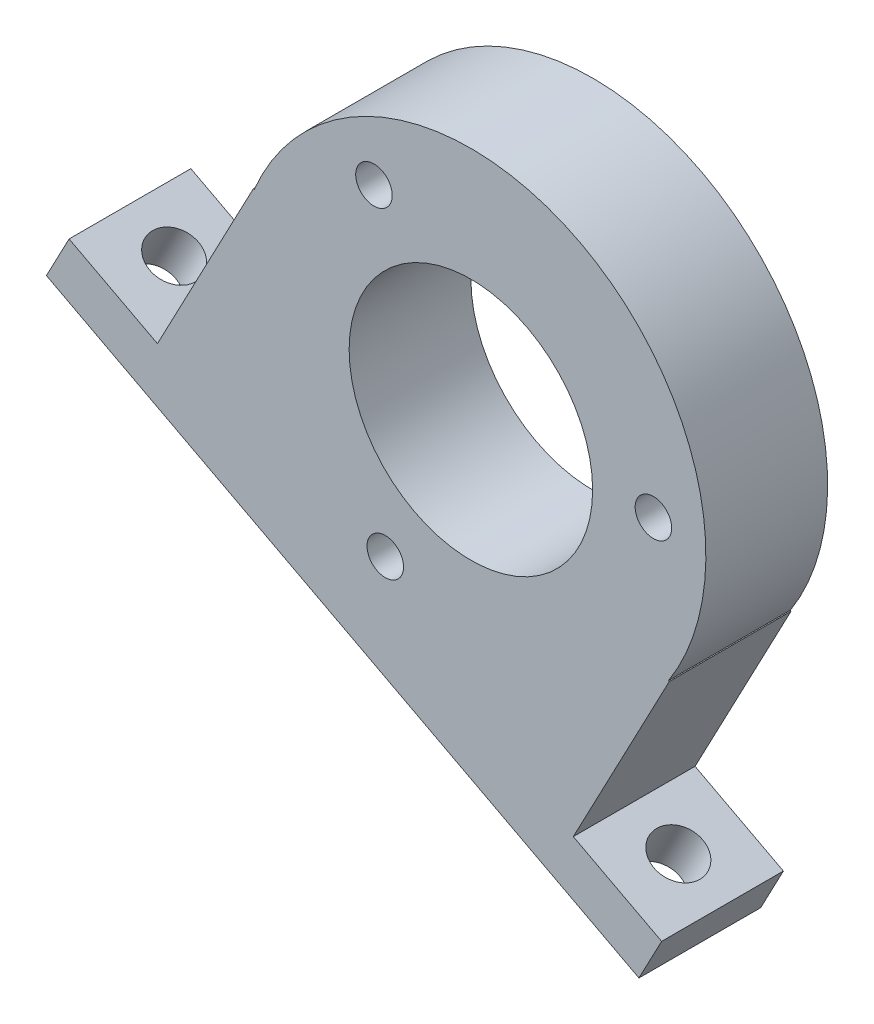
ISO-10303-21;
HEADER;
FILE_DESCRIPTION(('STEP AP214'),'2;1');
FILE_NAME('part.step','',(''),(''),'','','');
FILE_SCHEMA(('AUTOMOTIVE_DESIGN { 1 0 10303 214 1 1 1 1 }'));
ENDSEC;
DATA;
#1=APPLICATION_CONTEXT('core data for automotive mechanical design processes');
#2=APPLICATION_PROTOCOL_DEFINITION('international standard','automotive_design',2000,#1);
#3=PRODUCT_CONTEXT('',#1,'mechanical');
#4=PRODUCT('Part','Part','',(#3));
#5=PRODUCT_RELATED_PRODUCT_CATEGORY('part','',(#4));
#6=PRODUCT_DEFINITION_FORMATION('','',#4);
#7=PRODUCT_DEFINITION_CONTEXT('part definition',#1,'design');
#8=PRODUCT_DEFINITION('design','',#6,#7);
#9=PRODUCT_DEFINITION_SHAPE('','',#8);
#10=(LENGTH_UNIT() NAMED_UNIT(*) SI_UNIT(.MILLI.,.METRE.));
#11=(NAMED_UNIT(*) PLANE_ANGLE_UNIT() SI_UNIT($,.RADIAN.));
#12=(NAMED_UNIT(*) SI_UNIT($,.STERADIAN.) SOLID_ANGLE_UNIT());
#13=UNCERTAINTY_MEASURE_WITH_UNIT(LENGTH_MEASURE(1.E-05),#10,'distance_accuracy_value','');
#14=(GEOMETRIC_REPRESENTATION_CONTEXT(3) GLOBAL_UNCERTAINTY_ASSIGNED_CONTEXT((#13)) GLOBAL_UNIT_ASSIGNED_CONTEXT((#10,
#11,#12)) REPRESENTATION_CONTEXT('',''));
#15=CARTESIAN_POINT('',(0.,0.,0.));
#16=DIRECTION('',(0.,0.,1.));
#17=DIRECTION('',(1.,0.,0.));
#18=AXIS2_PLACEMENT_3D('',#15,#16,#17);
#19=CARTESIAN_POINT('',(20.1762336666455,11.5004949144842,0.));
#20=DIRECTION('',(-0.884809362447748,0.465953208085115,0.));
#21=DIRECTION('',(-0.465953208085115,-0.884809362447748,0.));
#22=AXIS2_PLACEMENT_3D('',#19,#20,#21);
#23=PLANE('',#22);
#24=DIRECTION('',(-0.465953208085115,-0.884809362447748,0.));
#25=VECTOR('',#24,1.);
#26=CARTESIAN_POINT('',(20.1762336666455,11.5004949144842,10.));
#27=LINE('',#26,#25);
#28=CARTESIAN_POINT('',(1.53810534324094,-23.8918795834258,10.));
#29=VERTEX_POINT('',#28);
#30=CARTESIAN_POINT('',(-0.325707489099525,-27.4311170332167,10.));
#31=VERTEX_POINT('',#30);
#32=EDGE_CURVE('E172',#29,#31,#27,.T.);
#33=ORIENTED_EDGE('',*,*,#32,.T.);
#34=DIRECTION('',(0.,0.,-1.));
#35=VECTOR('',#34,1.);
#36=CARTESIAN_POINT('',(-0.325707489099525,-27.4311170332167,50.));
#37=LINE('',#36,#35);
#38=CARTESIAN_POINT('',(-0.325707489099525,-27.4311170332167,0.));
#39=VERTEX_POINT('',#38);
#40=EDGE_CURVE('E161',#31,#39,#37,.T.);
#41=ORIENTED_EDGE('',*,*,#40,.T.);
#42=DIRECTION('',(-0.465953208085115,-0.884809362447748,0.));
#43=VECTOR('',#42,1.);
#44=CARTESIAN_POINT('',(20.1762336666455,11.5004949144842,0.));
#45=LINE('',#44,#43);
#46=CARTESIAN_POINT('',(1.53810534324094,-23.8918795834258,0.));
#47=VERTEX_POINT('',#46);
#48=EDGE_CURVE('E12',#47,#39,#45,.T.);
#49=ORIENTED_EDGE('',*,*,#48,.F.);
#50=DIRECTION('',(0.,0.,-1.));
#51=VECTOR('',#50,1.);
#52=CARTESIAN_POINT('',(1.53810534324094,-23.8918795834258,50.));
#53=LINE('',#52,#51);
#54=EDGE_CURVE('E199',#29,#47,#53,.T.);
#55=ORIENTED_EDGE('',*,*,#54,.F.);
#56=EDGE_LOOP('',(#33,#41,#49,#55));
#57=FACE_BOUND('',#56,.T.);
#58=ADVANCED_FACE('F81',(#57),#23,.F.);
#59=CARTESIAN_POINT('',(-28.4882812679806,37.1279213591655,0.));
#60=DIRECTION('',(-0.884809362447748,0.465953208085115,0.));
#61=DIRECTION('',(-0.465953208085115,-0.884809362447748,0.));
#62=AXIS2_PLACEMENT_3D('',#59,#60,#61);
#63=PLANE('',#62);
#64=DIRECTION('',(0.,0.,-1.));
#65=VECTOR('',#64,1.);
#66=CARTESIAN_POINT('',(-48.9902224237257,-1.80369058853542,50.));
#67=LINE('',#66,#65);
#68=CARTESIAN_POINT('',(-48.9902224237257,-1.80369058853542,10.));
#69=VERTEX_POINT('',#68);
#70=CARTESIAN_POINT('',(-48.9902224237257,-1.8036905885354,0.));
#71=VERTEX_POINT('',#70);
#72=EDGE_CURVE('E106',#69,#71,#67,.T.);
#73=ORIENTED_EDGE('',*,*,#72,.F.);
#74=DIRECTION('',(-0.465953208085115,-0.884809362447748,0.));
#75=VECTOR('',#74,1.);
#76=CARTESIAN_POINT('',(-28.4882812679806,37.1279213591655,9.99999999999999));
#77=LINE('',#76,#75);
#78=CARTESIAN_POINT('',(-47.1264095913852,1.73554686125559,10.));
#79=VERTEX_POINT('',#78);
#80=EDGE_CURVE('E231',#79,#69,#77,.T.);
#81=ORIENTED_EDGE('',*,*,#80,.F.);
#82=DIRECTION('',(0.,0.,-1.));
#83=VECTOR('',#82,1.);
#84=CARTESIAN_POINT('',(-47.1264095913852,1.73554686125559,50.));
#85=LINE('',#84,#83);
#86=CARTESIAN_POINT('',(-47.1264095913852,1.73554686125559,0.));
#87=VERTEX_POINT('',#86);
#88=EDGE_CURVE('E201',#79,#87,#85,.T.);
#89=ORIENTED_EDGE('',*,*,#88,.T.);
#90=DIRECTION('',(-0.465953208085115,-0.884809362447748,0.));
#91=VECTOR('',#90,1.);
#92=CARTESIAN_POINT('',(-28.4882812679806,37.1279213591655,0.));
#93=LINE('',#92,#91);
#94=EDGE_CURVE('E90',#87,#71,#93,.T.);
#95=ORIENTED_EDGE('',*,*,#94,.T.);
#96=EDGE_LOOP('',(#73,#81,#89,#95));
#97=FACE_BOUND('',#96,.T.);
#98=ADVANCED_FACE('F279',(#97),#63,.T.);
#99=CARTESIAN_POINT('',(-14.1274224536891,5.37928778044315,10.));
#100=DIRECTION('',(0.,0.,1.));
#101=DIRECTION('',(1.,0.,0.));
#102=AXIS2_PLACEMENT_3D('',#99,#100,#101);
#103=PLANE('',#102);
#104=CARTESIAN_POINT('',(0.862954928663437,5.916489730044,10.));
#105=DIRECTION('',(0.,0.,1.));
#106=DIRECTION('',(1.,0.,0.));
#107=AXIS2_PLACEMENT_3D('',#104,#105,#106);
#108=CIRCLE('',#107,1.5);
#109=CARTESIAN_POINT('',(2.36295492866344,5.916489730044,10.));
#110=VERTEX_POINT('',#109);
#111=EDGE_CURVE('E246',#110,#110,#108,.F.);
#112=ORIENTED_EDGE('',*,*,#111,.T.);
#113=EDGE_LOOP('',(#112));
#114=FACE_BOUND('',#113,.T.);
#115=CARTESIAN_POINT('',(-22.0878416801824,18.0927344310751,10.));
#116=DIRECTION('',(0.,0.,1.));
#117=DIRECTION('',(1.,0.,0.));
#118=AXIS2_PLACEMENT_3D('',#115,#116,#117);
#119=CIRCLE('',#118,1.5);
#120=CARTESIAN_POINT('',(-20.5878416801824,18.0927344310751,10.));
#121=VERTEX_POINT('',#120);
#122=EDGE_CURVE('E311',#121,#121,#119,.F.);
#123=ORIENTED_EDGE('',*,*,#122,.T.);
#124=EDGE_LOOP('',(#123));
#125=FACE_BOUND('',#124,.T.);
#126=CARTESIAN_POINT('',(-21.1573806095481,-7.87136081979077,10.));
#127=DIRECTION('',(0.,0.,1.));
#128=DIRECTION('',(1.,0.,0.));
#129=AXIS2_PLACEMENT_3D('',#126,#127,#128);
#130=CIRCLE('',#129,1.5);
#131=CARTESIAN_POINT('',(-19.6573806095481,-7.87136081979077,10.));
#132=VERTEX_POINT('',#131);
#133=EDGE_CURVE('E315',#132,#132,#130,.F.);
#134=ORIENTED_EDGE('',*,*,#133,.T.);
#135=EDGE_LOOP('',(#134));
#136=FACE_BOUND('',#135,.T.);
#137=CARTESIAN_POINT('',(-14.1274224536892,5.37928778044321,10.));
#138=DIRECTION('',(0.,0.,1.));
#139=DIRECTION('',(1.,0.,0.));
#140=AXIS2_PLACEMENT_3D('',#137,#138,#139);
#141=CIRCLE('',#140,10.);
#142=CARTESIAN_POINT('',(-4.12742245368918,5.37928778044321,10.));
#143=VERTEX_POINT('',#142);
#144=EDGE_CURVE('E318',#143,#143,#141,.F.);
#145=ORIENTED_EDGE('',*,*,#144,.T.);
#146=EDGE_LOOP('',(#145));
#147=FACE_BOUND('',#146,.T.);
#148=DIRECTION('',(-0.884809362447748,0.465953208085115,0.));
#149=VECTOR('',#148,1.);
#150=CARTESIAN_POINT('',(-24.6579649564127,-14.617403810876,10.));
#151=LINE('',#150,#149);
#152=EDGE_CURVE('E228',#31,#69,#151,.T.);
#153=ORIENTED_EDGE('',*,*,#152,.F.);
#154=ORIENTED_EDGE('',*,*,#32,.F.);
#155=DIRECTION('',(-0.884809362447748,0.465953208085115,0.));
#156=VECTOR('',#155,1.);
#157=CARTESIAN_POINT('',(-22.7941521240722,-11.078166361085,10.));
#158=LINE('',#157,#156);
#159=CARTESIAN_POINT('',(-5.7173314288307,-20.0710632771278,10.));
#160=VERTEX_POINT('',#159);
#161=EDGE_CURVE('E217',#29,#160,#158,.T.);
#162=ORIENTED_EDGE('',*,*,#161,.T.);
#163=DIRECTION('',(0.465953208085115,0.884809362447748,0.));
#164=VECTOR('',#163,1.);
#165=CARTESIAN_POINT('',(2.94939824155248,-3.61360913559957,10.));
#166=LINE('',#165,#164);
#167=CARTESIAN_POINT('',(2.17037819423765,-5.092908385907,10.));
#168=VERTEX_POINT('',#167);
#169=EDGE_CURVE('E220',#160,#168,#166,.T.);
#170=ORIENTED_EDGE('',*,*,#169,.T.);
#171=DIRECTION('',(0.884809362447748,-0.465953208085115,0.));
#172=VECTOR('',#171,1.);
#173=CARTESIAN_POINT('',(-14.9064425010039,3.89998853013572,10.));
#174=LINE('',#173,#172);
#175=CARTESIAN_POINT('',(2.10618453850619,-5.05910309281648,10.));
#176=VERTEX_POINT('',#175);
#177=EDGE_CURVE('E223',#176,#168,#174,.T.);
#178=ORIENTED_EDGE('',*,*,#177,.F.);
#179=CARTESIAN_POINT('',(-14.1274224536891,5.37928778044315,10.));
#180=DIRECTION('',(0.,0.,1.));
#181=DIRECTION('',(1.,0.,0.));
#182=AXIS2_PLACEMENT_3D('',#179,#180,#181);
#183=CIRCLE('',#182,19.3);
#184=CARTESIAN_POINT('',(-31.919069540514,12.8590801530879,10.));
#185=VERTEX_POINT('',#184);
#186=EDGE_CURVE('E225',#176,#185,#183,.T.);
#187=ORIENTED_EDGE('',*,*,#186,.T.);
#188=DIRECTION('',(0.884809362447748,-0.465953208085115,0.));
#189=VECTOR('',#188,1.);
#190=CARTESIAN_POINT('',(-14.9064425010039,3.89998853013572,10.));
#191=LINE('',#190,#189);
#192=CARTESIAN_POINT('',(-31.9832631962454,12.8928854461785,10.));
#193=VERTEX_POINT('',#192);
#194=EDGE_CURVE('E194',#193,#185,#191,.T.);
#195=ORIENTED_EDGE('',*,*,#194,.F.);
#196=DIRECTION('',(-0.465953208085116,-0.884809362447747,0.));
#197=VECTOR('',#196,1.);
#198=CARTESIAN_POINT('',(-31.2042431489306,14.3721846964859,10.));
#199=LINE('',#198,#197);
#200=CARTESIAN_POINT('',(-39.8709728193138,-2.0852694450423,10.));
#201=VERTEX_POINT('',#200);
#202=EDGE_CURVE('E211',#193,#201,#199,.T.);
#203=ORIENTED_EDGE('',*,*,#202,.T.);
#204=DIRECTION('',(-0.884809362447747,0.465953208085116,0.));
#205=VECTOR('',#204,1.);
#206=CARTESIAN_POINT('',(-22.7941521240723,-11.078166361085,10.));
#207=LINE('',#206,#205);
#208=EDGE_CURVE('E214',#201,#79,#207,.T.);
#209=ORIENTED_EDGE('',*,*,#208,.T.);
#210=ORIENTED_EDGE('',*,*,#80,.T.);
#211=EDGE_LOOP('',(#153,#154,#162,#170,#178,#187,#195,#203,#209,#210));
#212=FACE_BOUND('',#211,.T.);
#213=ADVANCED_FACE('F269',(#114,#125,#136,#147,#212),#103,.T.);
#214=CARTESIAN_POINT('',(-14.1274224536891,5.37928778044315,0.));
#215=DIRECTION('',(0.,0.,1.));
#216=DIRECTION('',(1.,0.,0.));
#217=AXIS2_PLACEMENT_3D('',#214,#215,#216);
#218=PLANE('',#217);
#219=CARTESIAN_POINT('',(0.862954928663437,5.916489730044,0.));
#220=DIRECTION('',(0.,0.,1.));
#221=DIRECTION('',(1.,0.,0.));
#222=AXIS2_PLACEMENT_3D('',#219,#220,#221);
#223=CIRCLE('',#222,1.5);
#224=CARTESIAN_POINT('',(2.36295492866344,5.916489730044,0.));
#225=VERTEX_POINT('',#224);
#226=EDGE_CURVE('E327',#225,#225,#223,.T.);
#227=ORIENTED_EDGE('',*,*,#226,.T.);
#228=EDGE_LOOP('',(#227));
#229=FACE_BOUND('',#228,.T.);
#230=CARTESIAN_POINT('',(-22.0878416801824,18.0927344310751,0.));
#231=DIRECTION('',(0.,0.,1.));
#232=DIRECTION('',(1.,0.,0.));
#233=AXIS2_PLACEMENT_3D('',#230,#231,#232);
#234=CIRCLE('',#233,1.5);
#235=CARTESIAN_POINT('',(-20.5878416801824,18.0927344310751,0.));
#236=VERTEX_POINT('',#235);
#237=EDGE_CURVE('E330',#236,#236,#234,.T.);
#238=ORIENTED_EDGE('',*,*,#237,.T.);
#239=EDGE_LOOP('',(#238));
#240=FACE_BOUND('',#239,.T.);
#241=CARTESIAN_POINT('',(-21.1573806095481,-7.87136081979077,0.));
#242=DIRECTION('',(0.,0.,1.));
#243=DIRECTION('',(1.,0.,0.));
#244=AXIS2_PLACEMENT_3D('',#241,#242,#243);
#245=CIRCLE('',#244,1.5);
#246=CARTESIAN_POINT('',(-19.6573806095481,-7.87136081979077,0.));
#247=VERTEX_POINT('',#246);
#248=EDGE_CURVE('E324',#247,#247,#245,.T.);
#249=ORIENTED_EDGE('',*,*,#248,.T.);
#250=EDGE_LOOP('',(#249));
#251=FACE_BOUND('',#250,.T.);
#252=CARTESIAN_POINT('',(-14.1274224536892,5.37928778044321,0.));
#253=DIRECTION('',(0.,0.,1.));
#254=DIRECTION('',(1.00000000000001,0.,0.));
#255=AXIS2_PLACEMENT_3D('',#252,#253,#254);
#256=CIRCLE('',#255,10.);
#257=CARTESIAN_POINT('',(-4.12742245368909,5.37928778044321,0.));
#258=VERTEX_POINT('',#257);
#259=EDGE_CURVE('E320',#258,#258,#256,.T.);
#260=ORIENTED_EDGE('',*,*,#259,.T.);
#261=EDGE_LOOP('',(#260));
#262=FACE_BOUND('',#261,.T.);
#263=ORIENTED_EDGE('',*,*,#48,.T.);
#264=DIRECTION('',(0.884809362447748,-0.465953208085115,0.));
#265=VECTOR('',#264,1.);
#266=CARTESIAN_POINT('',(-11.3800095058581,-21.6097642012335,0.));
#267=LINE('',#266,#265);
#268=EDGE_CURVE('E158',#71,#39,#267,.T.);
#269=ORIENTED_EDGE('',*,*,#268,.F.);
#270=ORIENTED_EDGE('',*,*,#94,.F.);
#271=DIRECTION('',(0.884809362447747,-0.465953208085116,0.));
#272=VECTOR('',#271,1.);
#273=CARTESIAN_POINT('',(-9.51619667351771,-18.0705267514426,0.));
#274=LINE('',#273,#272);
#275=CARTESIAN_POINT('',(-39.8709728193138,-2.0852694450423,0.));
#276=VERTEX_POINT('',#275);
#277=EDGE_CURVE('E183',#87,#276,#274,.T.);
#278=ORIENTED_EDGE('',*,*,#277,.T.);
#279=DIRECTION('',(0.465953208085116,0.884809362447747,0.));
#280=VECTOR('',#279,1.);
#281=CARTESIAN_POINT('',(-30.3547761457961,15.9852573064003,0.));
#282=LINE('',#281,#280);
#283=CARTESIAN_POINT('',(-31.9832631962454,12.8928854461785,0.));
#284=VERTEX_POINT('',#283);
#285=EDGE_CURVE('E188',#276,#284,#282,.T.);
#286=ORIENTED_EDGE('',*,*,#285,.T.);
#287=DIRECTION('',(-0.884809362447748,0.465953208085115,0.));
#288=VECTOR('',#287,1.);
#289=CARTESIAN_POINT('',(-1.62848705044933,-3.09237186022181,0.));
#290=LINE('',#289,#288);
#291=CARTESIAN_POINT('',(-31.919069540514,12.8590801530879,0.));
#292=VERTEX_POINT('',#291);
#293=EDGE_CURVE('E253',#292,#284,#290,.T.);
#294=ORIENTED_EDGE('',*,*,#293,.F.);
#295=CARTESIAN_POINT('',(-14.1274224536891,5.37928778044315,0.));
#296=DIRECTION('',(0.,0.,-1.));
#297=DIRECTION('',(-1.,0.,0.));
#298=AXIS2_PLACEMENT_3D('',#295,#296,#297);
#299=CIRCLE('',#298,19.3);
#300=CARTESIAN_POINT('',(2.10618453850619,-5.05910309281648,0.));
#301=VERTEX_POINT('',#300);
#302=EDGE_CURVE('E98',#292,#301,#299,.T.);
#303=ORIENTED_EDGE('',*,*,#302,.T.);
#304=CARTESIAN_POINT('',(2.17037819423765,-5.092908385907,0.));
#305=VERTEX_POINT('',#304);
#306=EDGE_CURVE('E185',#305,#301,#290,.T.);
#307=ORIENTED_EDGE('',*,*,#306,.F.);
#308=DIRECTION('',(-0.465953208085115,-0.884809362447748,0.));
#309=VECTOR('',#308,1.);
#310=CARTESIAN_POINT('',(3.79886524468698,-2.00053652568519,0.));
#311=LINE('',#310,#309);
#312=CARTESIAN_POINT('',(-5.7173314288307,-20.0710632771278,0.));
#313=VERTEX_POINT('',#312);
#314=EDGE_CURVE('E180',#305,#313,#311,.T.);
#315=ORIENTED_EDGE('',*,*,#314,.T.);
#316=DIRECTION('',(0.884809362447748,-0.465953208085115,0.));
#317=VECTOR('',#316,1.);
#318=CARTESIAN_POINT('',(-9.51619667351768,-18.0705267514426,0.));
#319=LINE('',#318,#317);
#320=EDGE_CURVE('E177',#313,#47,#319,.T.);
#321=ORIENTED_EDGE('',*,*,#320,.T.);
#322=EDGE_LOOP('',(#263,#269,#270,#278,#286,#294,#303,#307,#315,#321));
#323=FACE_BOUND('',#322,.T.);
#324=ADVANCED_FACE('F83',(#229,#240,#251,#262,#323),#218,.F.);
#325=CARTESIAN_POINT('',(-14.1274224536891,5.37928778044315,50.));
#326=DIRECTION('',(0.,0.,-1.));
#327=DIRECTION('',(-1.,0.,0.));
#328=AXIS2_PLACEMENT_3D('',#325,#326,#327);
#329=CYLINDRICAL_SURFACE('',#328,19.3);
#330=DIRECTION('',(0.,0.,-1.));
#331=VECTOR('',#330,1.);
#332=CARTESIAN_POINT('',(2.10618453850619,-5.05910309281648,50.));
#333=LINE('',#332,#331);
#334=EDGE_CURVE('E192',#176,#301,#333,.T.);
#335=ORIENTED_EDGE('',*,*,#334,.T.);
#336=ORIENTED_EDGE('',*,*,#302,.F.);
#337=DIRECTION('',(0.,0.,-1.));
#338=VECTOR('',#337,1.);
#339=CARTESIAN_POINT('',(-31.919069540514,12.8590801530879,50.));
#340=LINE('',#339,#338);
#341=EDGE_CURVE('E208',#185,#292,#340,.T.);
#342=ORIENTED_EDGE('',*,*,#341,.F.);
#343=ORIENTED_EDGE('',*,*,#186,.F.);
#344=EDGE_LOOP('',(#335,#336,#342,#343));
#345=FACE_BOUND('',#344,.T.);
#346=ADVANCED_FACE('F265',(#345),#329,.T.);
#347=CARTESIAN_POINT('',(-1.62848705044933,-3.09237186022181,50.));
#348=DIRECTION('',(-0.465953208085115,-0.884809362447748,0.));
#349=DIRECTION('',(0.884809362447748,-0.465953208085115,0.));
#350=AXIS2_PLACEMENT_3D('',#347,#348,#349);
#351=PLANE('',#350);
#352=ORIENTED_EDGE('',*,*,#177,.T.);
#353=DIRECTION('',(0.,0.,-1.));
#354=VECTOR('',#353,1.);
#355=CARTESIAN_POINT('',(2.17037819423765,-5.092908385907,50.));
#356=LINE('',#355,#354);
#357=EDGE_CURVE('E195',#168,#305,#356,.T.);
#358=ORIENTED_EDGE('',*,*,#357,.T.);
#359=ORIENTED_EDGE('',*,*,#306,.T.);
#360=ORIENTED_EDGE('',*,*,#334,.F.);
#361=EDGE_LOOP('',(#352,#358,#359,#360));
#362=FACE_BOUND('',#361,.T.);
#363=ADVANCED_FACE('F272',(#362),#351,.F.);
#364=CARTESIAN_POINT('',(3.79886524468698,-2.00053652568519,50.));
#365=DIRECTION('',(0.884809362447748,-0.465953208085115,0.));
#366=DIRECTION('',(0.465953208085115,0.884809362447748,0.));
#367=AXIS2_PLACEMENT_3D('',#364,#365,#366);
#368=PLANE('',#367);
#369=DIRECTION('',(0.,0.,-1.));
#370=VECTOR('',#369,1.);
#371=CARTESIAN_POINT('',(-5.7173314288307,-20.0710632771278,50.));
#372=LINE('',#371,#370);
#373=EDGE_CURVE('E197',#160,#313,#372,.T.);
#374=ORIENTED_EDGE('',*,*,#373,.T.);
#375=ORIENTED_EDGE('',*,*,#314,.F.);
#376=ORIENTED_EDGE('',*,*,#357,.F.);
#377=ORIENTED_EDGE('',*,*,#169,.F.);
#378=EDGE_LOOP('',(#374,#375,#376,#377));
#379=FACE_BOUND('',#378,.T.);
#380=ADVANCED_FACE('F275',(#379),#368,.T.);
#381=CARTESIAN_POINT('',(-9.51619667351768,-18.0705267514426,50.));
#382=DIRECTION('',(0.465953208085115,0.884809362447748,0.));
#383=DIRECTION('',(-0.884809362447748,0.465953208085115,0.));
#384=AXIS2_PLACEMENT_3D('',#381,#382,#383);
#385=PLANE('',#384);
#386=CARTESIAN_POINT('',(-2.08961304279489,-21.9814714302768,5.));
#387=DIRECTION('',(0.465953208085116,0.884809362447747,0.));
#388=DIRECTION('',(-0.884809362447747,0.465953208085116,0.));
#389=AXIS2_PLACEMENT_3D('',#386,#387,#388);
#390=CIRCLE('',#389,2.);
#391=CARTESIAN_POINT('',(-3.85923176769038,-21.0495650141066,5.));
#392=VERTEX_POINT('',#391);
#393=EDGE_CURVE('E241',#392,#392,#390,.T.);
#394=ORIENTED_EDGE('',*,*,#393,.F.);
#395=EDGE_LOOP('',(#394));
#396=FACE_BOUND('',#395,.T.);
#397=ORIENTED_EDGE('',*,*,#54,.T.);
#398=ORIENTED_EDGE('',*,*,#320,.F.);
#399=ORIENTED_EDGE('',*,*,#373,.F.);
#400=ORIENTED_EDGE('',*,*,#161,.F.);
#401=EDGE_LOOP('',(#397,#398,#399,#400));
#402=FACE_BOUND('',#401,.T.);
#403=ADVANCED_FACE('F276',(#396,#402),#385,.T.);
#404=CARTESIAN_POINT('',(-9.51619667351771,-18.0705267514426,50.));
#405=DIRECTION('',(0.465953208085116,0.884809362447747,0.));
#406=DIRECTION('',(-0.884809362447747,0.465953208085116,0.));
#407=AXIS2_PLACEMENT_3D('',#404,#405,#406);
#408=PLANE('',#407);
#409=CARTESIAN_POINT('',(-43.4986912053495,-0.174861291893362,5.));
#410=DIRECTION('',(0.465953208085116,0.884809362447747,0.));
#411=DIRECTION('',(-0.884809362447747,0.465953208085116,0.));
#412=AXIS2_PLACEMENT_3D('',#409,#410,#411);
#413=CIRCLE('',#412,2.);
#414=CARTESIAN_POINT('',(-45.268309930245,0.75704512427687,5.));
#415=VERTEX_POINT('',#414);
#416=EDGE_CURVE('E236',#415,#415,#413,.T.);
#417=ORIENTED_EDGE('',*,*,#416,.F.);
#418=EDGE_LOOP('',(#417));
#419=FACE_BOUND('',#418,.T.);
#420=DIRECTION('',(0.,0.,-1.));
#421=VECTOR('',#420,1.);
#422=CARTESIAN_POINT('',(-39.8709728193138,-2.0852694450423,50.));
#423=LINE('',#422,#421);
#424=EDGE_CURVE('E204',#201,#276,#423,.T.);
#425=ORIENTED_EDGE('',*,*,#424,.T.);
#426=ORIENTED_EDGE('',*,*,#277,.F.);
#427=ORIENTED_EDGE('',*,*,#88,.F.);
#428=ORIENTED_EDGE('',*,*,#208,.F.);
#429=EDGE_LOOP('',(#425,#426,#427,#428));
#430=FACE_BOUND('',#429,.T.);
#431=ADVANCED_FACE('F281',(#419,#430),#408,.T.);
#432=CARTESIAN_POINT('',(-30.3547761457961,15.9852573064003,50.));
#433=DIRECTION('',(-0.884809362447747,0.465953208085116,0.));
#434=DIRECTION('',(-0.465953208085116,-0.884809362447747,0.));
#435=AXIS2_PLACEMENT_3D('',#432,#433,#434);
#436=PLANE('',#435);
#437=DIRECTION('',(0.,0.,-1.));
#438=VECTOR('',#437,1.);
#439=CARTESIAN_POINT('',(-31.9832631962454,12.8928854461785,50.));
#440=LINE('',#439,#438);
#441=EDGE_CURVE('E206',#193,#284,#440,.T.);
#442=ORIENTED_EDGE('',*,*,#441,.T.);
#443=ORIENTED_EDGE('',*,*,#285,.F.);
#444=ORIENTED_EDGE('',*,*,#424,.F.);
#445=ORIENTED_EDGE('',*,*,#202,.F.);
#446=EDGE_LOOP('',(#442,#443,#444,#445));
#447=FACE_BOUND('',#446,.T.);
#448=ADVANCED_FACE('F260',(#447),#436,.T.);
#449=ORIENTED_EDGE('',*,*,#194,.T.);
#450=ORIENTED_EDGE('',*,*,#341,.T.);
#451=ORIENTED_EDGE('',*,*,#293,.T.);
#452=ORIENTED_EDGE('',*,*,#441,.F.);
#453=EDGE_LOOP('',(#449,#450,#451,#452));
#454=FACE_BOUND('',#453,.T.);
#455=ADVANCED_FACE('F264',(#454),#351,.F.);
#456=CARTESIAN_POINT('',(-11.3800095058581,-21.6097642012335,50.));
#457=DIRECTION('',(0.465953208085115,0.884809362447748,0.));
#458=DIRECTION('',(-0.884809362447748,0.465953208085115,0.));
#459=AXIS2_PLACEMENT_3D('',#456,#457,#458);
#460=PLANE('',#459);
#461=CARTESIAN_POINT('',(-45.3625040376899,-3.71409874168435,5.));
#462=DIRECTION('',(0.465953208085115,0.884809362447748,0.));
#463=DIRECTION('',(-0.884809362447748,0.465953208085115,0.));
#464=AXIS2_PLACEMENT_3D('',#461,#462,#463);
#465=CIRCLE('',#464,2.);
#466=CARTESIAN_POINT('',(-47.1321227625854,-2.78219232551412,5.));
#467=VERTEX_POINT('',#466);
#468=EDGE_CURVE('E85',#467,#467,#465,.T.);
#469=ORIENTED_EDGE('',*,*,#468,.T.);
#470=EDGE_LOOP('',(#469));
#471=FACE_BOUND('',#470,.T.);
#472=CARTESIAN_POINT('',(-3.95342587513533,-25.5207088800677,5.));
#473=DIRECTION('',(0.465953208085115,0.884809362447748,0.));
#474=DIRECTION('',(-0.884809362447748,0.465953208085115,0.));
#475=AXIS2_PLACEMENT_3D('',#472,#473,#474);
#476=CIRCLE('',#475,2.);
#477=CARTESIAN_POINT('',(-5.72304460003082,-24.5888024638975,5.));
#478=VERTEX_POINT('',#477);
#479=EDGE_CURVE('E234',#478,#478,#476,.T.);
#480=ORIENTED_EDGE('',*,*,#479,.T.);
#481=EDGE_LOOP('',(#480));
#482=FACE_BOUND('',#481,.T.);
#483=ORIENTED_EDGE('',*,*,#152,.T.);
#484=ORIENTED_EDGE('',*,*,#72,.T.);
#485=ORIENTED_EDGE('',*,*,#268,.T.);
#486=ORIENTED_EDGE('',*,*,#40,.F.);
#487=EDGE_LOOP('',(#483,#484,#485,#486));
#488=FACE_BOUND('',#487,.T.);
#489=ADVANCED_FACE('F160',(#471,#482,#488),#460,.F.);
#490=CARTESIAN_POINT('',(-25.3872734470507,-66.2219395526641,5.));
#491=DIRECTION('',(0.465953208085116,0.884809362447747,0.));
#492=DIRECTION('',(-0.884809362447747,0.465953208085116,0.));
#493=AXIS2_PLACEMENT_3D('',#490,#491,#492);
#494=CYLINDRICAL_SURFACE('',#493,2.);
#495=ORIENTED_EDGE('',*,*,#393,.T.);
#496=EDGE_LOOP('',(#495));
#497=FACE_BOUND('',#496,.T.);
#498=ORIENTED_EDGE('',*,*,#479,.F.);
#499=EDGE_LOOP('',(#498));
#500=FACE_BOUND('',#499,.T.);
#501=ADVANCED_FACE('F359',(#497,#500),#494,.F.);
#502=CARTESIAN_POINT('',(-66.7963516096053,-44.4153294142807,5.));
#503=DIRECTION('',(0.465953208085116,0.884809362447747,0.));
#504=DIRECTION('',(-0.884809362447747,0.465953208085116,0.));
#505=AXIS2_PLACEMENT_3D('',#502,#503,#504);
#506=CYLINDRICAL_SURFACE('',#505,2.);
#507=ORIENTED_EDGE('',*,*,#416,.T.);
#508=EDGE_LOOP('',(#507));
#509=FACE_BOUND('',#508,.T.);
#510=ORIENTED_EDGE('',*,*,#468,.F.);
#511=EDGE_LOOP('',(#510));
#512=FACE_BOUND('',#511,.T.);
#513=ADVANCED_FACE('F351',(#509,#512),#506,.F.);
#514=CARTESIAN_POINT('',(-14.1274224536892,5.37928778044321,50.));
#515=DIRECTION('',(0.,0.,-1.));
#516=DIRECTION('',(-1.,0.,0.));
#517=AXIS2_PLACEMENT_3D('',#514,#515,#516);
#518=CYLINDRICAL_SURFACE('',#517,10.);
#519=ORIENTED_EDGE('',*,*,#144,.F.);
#520=EDGE_LOOP('',(#519));
#521=FACE_BOUND('',#520,.T.);
#522=ORIENTED_EDGE('',*,*,#259,.F.);
#523=EDGE_LOOP('',(#522));
#524=FACE_BOUND('',#523,.T.);
#525=ADVANCED_FACE('F341',(#521,#524),#518,.F.);
#526=CARTESIAN_POINT('',(-21.1573806095481,-7.87136081979077,50.));
#527=DIRECTION('',(0.,0.,-1.));
#528=DIRECTION('',(-1.,0.,0.));
#529=AXIS2_PLACEMENT_3D('',#526,#527,#528);
#530=CYLINDRICAL_SURFACE('',#529,1.5);
#531=ORIENTED_EDGE('',*,*,#133,.F.);
#532=EDGE_LOOP('',(#531));
#533=FACE_BOUND('',#532,.T.);
#534=ORIENTED_EDGE('',*,*,#248,.F.);
#535=EDGE_LOOP('',(#534));
#536=FACE_BOUND('',#535,.T.);
#537=ADVANCED_FACE('F338',(#533,#536),#530,.F.);
#538=CARTESIAN_POINT('',(-22.0878416801824,18.0927344310751,50.));
#539=DIRECTION('',(0.,0.,-1.));
#540=DIRECTION('',(-1.,0.,0.));
#541=AXIS2_PLACEMENT_3D('',#538,#539,#540);
#542=CYLINDRICAL_SURFACE('',#541,1.5);
#543=ORIENTED_EDGE('',*,*,#122,.F.);
#544=EDGE_LOOP('',(#543));
#545=FACE_BOUND('',#544,.T.);
#546=ORIENTED_EDGE('',*,*,#237,.F.);
#547=EDGE_LOOP('',(#546));
#548=FACE_BOUND('',#547,.T.);
#549=ADVANCED_FACE('F340',(#545,#548),#542,.F.);
#550=CARTESIAN_POINT('',(0.862954928663437,5.916489730044,50.));
#551=DIRECTION('',(0.,0.,-1.));
#552=DIRECTION('',(-1.,0.,0.));
#553=AXIS2_PLACEMENT_3D('',#550,#551,#552);
#554=CYLINDRICAL_SURFACE('',#553,1.5);
#555=ORIENTED_EDGE('',*,*,#111,.F.);
#556=EDGE_LOOP('',(#555));
#557=FACE_BOUND('',#556,.T.);
#558=ORIENTED_EDGE('',*,*,#226,.F.);
#559=EDGE_LOOP('',(#558));
#560=FACE_BOUND('',#559,.T.);
#561=ADVANCED_FACE('F348',(#557,#560),#554,.F.);
#562=CLOSED_SHELL('',(#58,#98,#213,#324,#346,#363,#380,#403,#431,#448,#455,#489,#501,#513,#525,
#537,#549,#561));
#563=MANIFOLD_SOLID_BREP('B2',#562);
#564=ADVANCED_BREP_SHAPE_REPRESENTATION('',(#18,#563),#14);
#565=SHAPE_DEFINITION_REPRESENTATION(#9,#564);
ENDSEC;
END-ISO-10303-21;
